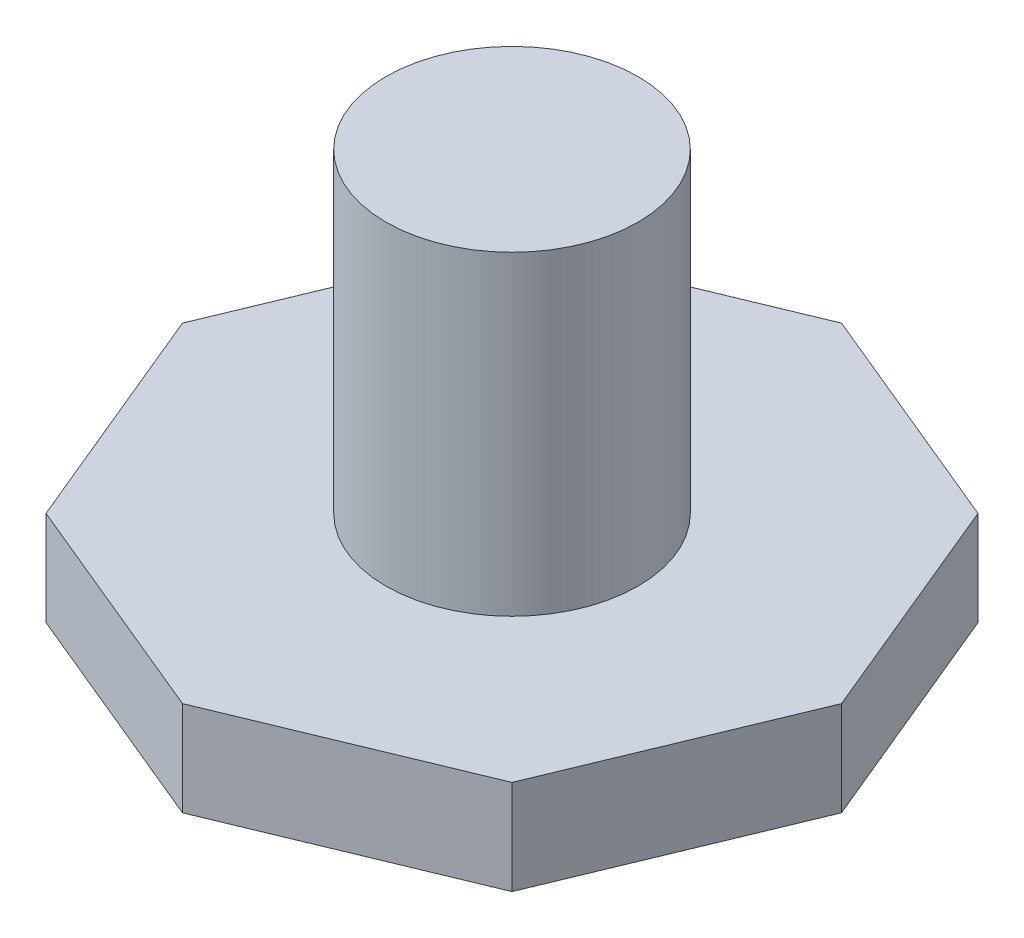
ISO-10303-21;
HEADER;
FILE_DESCRIPTION(('STEP AP214'),'2;1');
FILE_NAME('part.step','',(''),(''),'','','');
FILE_SCHEMA(('AUTOMOTIVE_DESIGN { 1 0 10303 214 1 1 1 1 }'));
ENDSEC;
DATA;
#1=APPLICATION_CONTEXT('core data for automotive mechanical design processes');
#2=APPLICATION_PROTOCOL_DEFINITION('international standard','automotive_design',2000,#1);
#3=PRODUCT_CONTEXT('',#1,'mechanical');
#4=PRODUCT('Part','Part','',(#3));
#5=PRODUCT_RELATED_PRODUCT_CATEGORY('part','',(#4));
#6=PRODUCT_DEFINITION_FORMATION('','',#4);
#7=PRODUCT_DEFINITION_CONTEXT('part definition',#1,'design');
#8=PRODUCT_DEFINITION('design','',#6,#7);
#9=PRODUCT_DEFINITION_SHAPE('','',#8);
#10=(LENGTH_UNIT() NAMED_UNIT(*) SI_UNIT(.MILLI.,.METRE.));
#11=(NAMED_UNIT(*) PLANE_ANGLE_UNIT() SI_UNIT($,.RADIAN.));
#12=(NAMED_UNIT(*) SI_UNIT($,.STERADIAN.) SOLID_ANGLE_UNIT());
#13=UNCERTAINTY_MEASURE_WITH_UNIT(LENGTH_MEASURE(1.E-05),#10,'distance_accuracy_value','');
#14=(GEOMETRIC_REPRESENTATION_CONTEXT(3) GLOBAL_UNCERTAINTY_ASSIGNED_CONTEXT((#13)) GLOBAL_UNIT_ASSIGNED_CONTEXT((#10,
#11,#12)) REPRESENTATION_CONTEXT('',''));
#15=CARTESIAN_POINT('',(0.,0.,0.));
#16=DIRECTION('',(0.,0.,1.));
#17=DIRECTION('',(1.,0.,0.));
#18=AXIS2_PLACEMENT_3D('',#15,#16,#17);
#19=CARTESIAN_POINT('',(3.69551813004517,1.5,3.69551813004512));
#20=DIRECTION('',(-0.923879532511289,0.,-0.382683432365084));
#21=DIRECTION('',(-0.382683432365084,0.,0.923879532511289));
#22=AXIS2_PLACEMENT_3D('',#19,#20,#21);
#23=PLANE('',#22);
#24=DIRECTION('',(0.382683432365084,0.,-0.923879532511289));
#25=VECTOR('',#24,1.);
#26=CARTESIAN_POINT('',(3.69551813004517,0.,3.69551813004512));
#27=LINE('',#26,#25);
#28=CARTESIAN_POINT('',(3.69551813004517,0.,3.69551813004512));
#29=VERTEX_POINT('',#28);
#30=CARTESIAN_POINT('',(5.22625185950551,0.,0.));
#31=VERTEX_POINT('',#30);
#32=EDGE_CURVE('E146',#29,#31,#27,.T.);
#33=ORIENTED_EDGE('',*,*,#32,.T.);
#34=DIRECTION('',(0.,-1.,0.));
#35=VECTOR('',#34,1.);
#36=CARTESIAN_POINT('',(5.22625185950551,1.5,0.));
#37=LINE('',#36,#35);
#38=CARTESIAN_POINT('',(5.22625185950551,1.5,0.));
#39=VERTEX_POINT('',#38);
#40=EDGE_CURVE('E46',#39,#31,#37,.T.);
#41=ORIENTED_EDGE('',*,*,#40,.F.);
#42=DIRECTION('',(0.382683432365084,0.,-0.923879532511289));
#43=VECTOR('',#42,1.);
#44=CARTESIAN_POINT('',(3.69551813004517,1.5,3.69551813004512));
#45=LINE('',#44,#43);
#46=CARTESIAN_POINT('',(3.69551813004517,1.5,3.69551813004512));
#47=VERTEX_POINT('',#46);
#48=EDGE_CURVE('E169',#47,#39,#45,.T.);
#49=ORIENTED_EDGE('',*,*,#48,.F.);
#50=DIRECTION('',(0.,-1.,0.));
#51=VECTOR('',#50,1.);
#52=CARTESIAN_POINT('',(3.69551813004517,1.5,3.69551813004512));
#53=LINE('',#52,#51);
#54=EDGE_CURVE('E142',#47,#29,#53,.T.);
#55=ORIENTED_EDGE('',*,*,#54,.T.);
#56=EDGE_LOOP('',(#33,#41,#49,#55));
#57=FACE_BOUND('',#56,.T.);
#58=ADVANCED_FACE('F43',(#57),#23,.F.);
#59=CARTESIAN_POINT('',(5.22625185950551,1.5,0.));
#60=DIRECTION('',(-0.923879532511284,0.,0.382683432365095));
#61=DIRECTION('',(0.382683432365096,0.,0.923879532511285));
#62=AXIS2_PLACEMENT_3D('',#59,#60,#61);
#63=PLANE('',#62);
#64=DIRECTION('',(-0.382683432365096,0.,-0.923879532511285));
#65=VECTOR('',#64,1.);
#66=CARTESIAN_POINT('',(5.22625185950551,0.,0.));
#67=LINE('',#66,#65);
#68=CARTESIAN_POINT('',(3.69551813004512,0.,-3.69551813004517));
#69=VERTEX_POINT('',#68);
#70=EDGE_CURVE('E150',#31,#69,#67,.T.);
#71=ORIENTED_EDGE('',*,*,#70,.T.);
#72=DIRECTION('',(0.,-1.,0.));
#73=VECTOR('',#72,1.);
#74=CARTESIAN_POINT('',(3.69551813004512,1.5,-3.69551813004517));
#75=LINE('',#74,#73);
#76=CARTESIAN_POINT('',(3.69551813004512,1.5,-3.69551813004517));
#77=VERTEX_POINT('',#76);
#78=EDGE_CURVE('E183',#77,#69,#75,.T.);
#79=ORIENTED_EDGE('',*,*,#78,.F.);
#80=DIRECTION('',(-0.382683432365096,0.,-0.923879532511285));
#81=VECTOR('',#80,1.);
#82=CARTESIAN_POINT('',(5.22625185950551,1.5,0.));
#83=LINE('',#82,#81);
#84=EDGE_CURVE('E105',#39,#77,#83,.T.);
#85=ORIENTED_EDGE('',*,*,#84,.F.);
#86=ORIENTED_EDGE('',*,*,#40,.T.);
#87=EDGE_LOOP('',(#71,#79,#85,#86));
#88=FACE_BOUND('',#87,.T.);
#89=ADVANCED_FACE('F191',(#88),#63,.F.);
#90=CARTESIAN_POINT('',(3.69551813004512,1.5,-3.69551813004517));
#91=DIRECTION('',(-0.382683432365084,0.,0.923879532511289));
#92=DIRECTION('',(0.923879532511289,0.,0.382683432365084));
#93=AXIS2_PLACEMENT_3D('',#90,#91,#92);
#94=PLANE('',#93);
#95=DIRECTION('',(-0.923879532511289,0.,-0.382683432365084));
#96=VECTOR('',#95,1.);
#97=CARTESIAN_POINT('',(3.69551813004512,0.,-3.69551813004517));
#98=LINE('',#97,#96);
#99=CARTESIAN_POINT('',(0.,0.,-5.22625185950551));
#100=VERTEX_POINT('',#99);
#101=EDGE_CURVE('E154',#69,#100,#98,.T.);
#102=ORIENTED_EDGE('',*,*,#101,.T.);
#103=DIRECTION('',(0.,-1.,0.));
#104=VECTOR('',#103,1.);
#105=CARTESIAN_POINT('',(0.,1.5,-5.22625185950551));
#106=LINE('',#105,#104);
#107=CARTESIAN_POINT('',(0.,1.5,-5.22625185950551));
#108=VERTEX_POINT('',#107);
#109=EDGE_CURVE('E180',#108,#100,#106,.T.);
#110=ORIENTED_EDGE('',*,*,#109,.F.);
#111=DIRECTION('',(-0.923879532511289,0.,-0.382683432365084));
#112=VECTOR('',#111,1.);
#113=CARTESIAN_POINT('',(3.69551813004512,1.5,-3.69551813004517));
#114=LINE('',#113,#112);
#115=EDGE_CURVE('E207',#77,#108,#114,.T.);
#116=ORIENTED_EDGE('',*,*,#115,.F.);
#117=ORIENTED_EDGE('',*,*,#78,.T.);
#118=EDGE_LOOP('',(#102,#110,#116,#117));
#119=FACE_BOUND('',#118,.T.);
#120=ADVANCED_FACE('F200',(#119),#94,.F.);
#121=CARTESIAN_POINT('',(0.,1.5,-5.22625185950551));
#122=DIRECTION('',(0.382683432365095,0.,0.923879532511285));
#123=DIRECTION('',(0.923879532511285,0.,-0.382683432365095));
#124=AXIS2_PLACEMENT_3D('',#121,#122,#123);
#125=PLANE('',#124);
#126=DIRECTION('',(-0.923879532511285,0.,0.382683432365095));
#127=VECTOR('',#126,1.);
#128=CARTESIAN_POINT('',(0.,0.,-5.22625185950551));
#129=LINE('',#128,#127);
#130=CARTESIAN_POINT('',(-3.69551813004517,0.,-3.69551813004513));
#131=VERTEX_POINT('',#130);
#132=EDGE_CURVE('E157',#100,#131,#129,.T.);
#133=ORIENTED_EDGE('',*,*,#132,.T.);
#134=DIRECTION('',(0.,-1.,0.));
#135=VECTOR('',#134,1.);
#136=CARTESIAN_POINT('',(-3.69551813004517,1.5,-3.69551813004513));
#137=LINE('',#136,#135);
#138=CARTESIAN_POINT('',(-3.69551813004517,1.5,-3.69551813004513));
#139=VERTEX_POINT('',#138);
#140=EDGE_CURVE('E176',#139,#131,#137,.T.);
#141=ORIENTED_EDGE('',*,*,#140,.F.);
#142=DIRECTION('',(-0.923879532511285,0.,0.382683432365095));
#143=VECTOR('',#142,1.);
#144=CARTESIAN_POINT('',(0.,1.5,-5.22625185950551));
#145=LINE('',#144,#143);
#146=EDGE_CURVE('E205',#108,#139,#145,.T.);
#147=ORIENTED_EDGE('',*,*,#146,.F.);
#148=ORIENTED_EDGE('',*,*,#109,.T.);
#149=EDGE_LOOP('',(#133,#141,#147,#148));
#150=FACE_BOUND('',#149,.T.);
#151=ADVANCED_FACE('F203',(#150),#125,.F.);
#152=CARTESIAN_POINT('',(-3.69551813004517,1.5,-3.69551813004513));
#153=DIRECTION('',(0.923879532511289,0.,0.382683432365084));
#154=DIRECTION('',(0.382683432365084,0.,-0.923879532511289));
#155=AXIS2_PLACEMENT_3D('',#152,#153,#154);
#156=PLANE('',#155);
#157=DIRECTION('',(-0.382683432365084,0.,0.923879532511289));
#158=VECTOR('',#157,1.);
#159=CARTESIAN_POINT('',(-3.69551813004517,0.,-3.69551813004513));
#160=LINE('',#159,#158);
#161=CARTESIAN_POINT('',(-5.22625185950551,0.,0.));
#162=VERTEX_POINT('',#161);
#163=EDGE_CURVE('E160',#131,#162,#160,.T.);
#164=ORIENTED_EDGE('',*,*,#163,.T.);
#165=DIRECTION('',(0.,-1.,0.));
#166=VECTOR('',#165,1.);
#167=CARTESIAN_POINT('',(-5.22625185950551,1.5,0.));
#168=LINE('',#167,#166);
#169=CARTESIAN_POINT('',(-5.22625185950551,1.5,0.));
#170=VERTEX_POINT('',#169);
#171=EDGE_CURVE('E135',#170,#162,#168,.T.);
#172=ORIENTED_EDGE('',*,*,#171,.F.);
#173=DIRECTION('',(-0.382683432365084,0.,0.923879532511289));
#174=VECTOR('',#173,1.);
#175=CARTESIAN_POINT('',(-3.69551813004517,1.5,-3.69551813004513));
#176=LINE('',#175,#174);
#177=EDGE_CURVE('E124',#139,#170,#176,.T.);
#178=ORIENTED_EDGE('',*,*,#177,.F.);
#179=ORIENTED_EDGE('',*,*,#140,.T.);
#180=EDGE_LOOP('',(#164,#172,#178,#179));
#181=FACE_BOUND('',#180,.T.);
#182=ADVANCED_FACE('F249',(#181),#156,.F.);
#183=CARTESIAN_POINT('',(-5.22625185950551,1.5,0.));
#184=DIRECTION('',(0.923879532511284,0.,-0.382683432365097));
#185=DIRECTION('',(-0.382683432365097,0.,-0.923879532511284));
#186=AXIS2_PLACEMENT_3D('',#183,#184,#185);
#187=PLANE('',#186);
#188=DIRECTION('',(0.382683432365097,0.,0.923879532511284));
#189=VECTOR('',#188,1.);
#190=CARTESIAN_POINT('',(-5.22625185950551,0.,0.));
#191=LINE('',#190,#189);
#192=CARTESIAN_POINT('',(-3.69551813004512,0.,3.69551813004517));
#193=VERTEX_POINT('',#192);
#194=EDGE_CURVE('E133',#162,#193,#191,.T.);
#195=ORIENTED_EDGE('',*,*,#194,.T.);
#196=DIRECTION('',(0.,-1.,0.));
#197=VECTOR('',#196,1.);
#198=CARTESIAN_POINT('',(-3.69551813004512,1.5,3.69551813004517));
#199=LINE('',#198,#197);
#200=CARTESIAN_POINT('',(-3.69551813004512,1.5,3.69551813004517));
#201=VERTEX_POINT('',#200);
#202=EDGE_CURVE('E130',#201,#193,#199,.T.);
#203=ORIENTED_EDGE('',*,*,#202,.F.);
#204=DIRECTION('',(0.382683432365097,0.,0.923879532511284));
#205=VECTOR('',#204,1.);
#206=CARTESIAN_POINT('',(-5.22625185950551,1.5,0.));
#207=LINE('',#206,#205);
#208=EDGE_CURVE('E118',#170,#201,#207,.T.);
#209=ORIENTED_EDGE('',*,*,#208,.F.);
#210=ORIENTED_EDGE('',*,*,#171,.T.);
#211=EDGE_LOOP('',(#195,#203,#209,#210));
#212=FACE_BOUND('',#211,.T.);
#213=ADVANCED_FACE('F131',(#212),#187,.F.);
#214=CARTESIAN_POINT('',(-3.69551813004512,1.5,3.69551813004517));
#215=DIRECTION('',(0.382683432365084,0.,-0.923879532511289));
#216=DIRECTION('',(-0.923879532511289,0.,-0.382683432365084));
#217=AXIS2_PLACEMENT_3D('',#214,#215,#216);
#218=PLANE('',#217);
#219=DIRECTION('',(0.923879532511289,0.,0.382683432365084));
#220=VECTOR('',#219,1.);
#221=CARTESIAN_POINT('',(-3.69551813004512,0.,3.69551813004517));
#222=LINE('',#221,#220);
#223=CARTESIAN_POINT('',(0.,0.,5.2262518595055));
#224=VERTEX_POINT('',#223);
#225=EDGE_CURVE('E90',#193,#224,#222,.T.);
#226=ORIENTED_EDGE('',*,*,#225,.T.);
#227=DIRECTION('',(0.,-1.,0.));
#228=VECTOR('',#227,1.);
#229=CARTESIAN_POINT('',(0.,1.5,5.2262518595055));
#230=LINE('',#229,#228);
#231=CARTESIAN_POINT('',(0.,1.5,5.2262518595055));
#232=VERTEX_POINT('',#231);
#233=EDGE_CURVE('E136',#232,#224,#230,.T.);
#234=ORIENTED_EDGE('',*,*,#233,.F.);
#235=DIRECTION('',(0.923879532511289,0.,0.382683432365084));
#236=VECTOR('',#235,1.);
#237=CARTESIAN_POINT('',(-3.69551813004512,1.5,3.69551813004517));
#238=LINE('',#237,#236);
#239=EDGE_CURVE('E122',#201,#232,#238,.T.);
#240=ORIENTED_EDGE('',*,*,#239,.F.);
#241=ORIENTED_EDGE('',*,*,#202,.T.);
#242=EDGE_LOOP('',(#226,#234,#240,#241));
#243=FACE_BOUND('',#242,.T.);
#244=ADVANCED_FACE('F138',(#243),#218,.F.);
#245=CARTESIAN_POINT('',(0.,1.5,5.2262518595055));
#246=DIRECTION('',(-0.382683432365095,0.,-0.923879532511284));
#247=DIRECTION('',(-0.923879532511284,0.,0.382683432365095));
#248=AXIS2_PLACEMENT_3D('',#245,#246,#247);
#249=PLANE('',#248);
#250=DIRECTION('',(0.923879532511285,0.,-0.382683432365095));
#251=VECTOR('',#250,1.);
#252=CARTESIAN_POINT('',(0.,0.,5.2262518595055));
#253=LINE('',#252,#251);
#254=EDGE_CURVE('E96',#224,#29,#253,.T.);
#255=ORIENTED_EDGE('',*,*,#254,.T.);
#256=ORIENTED_EDGE('',*,*,#54,.F.);
#257=DIRECTION('',(0.923879532511285,0.,-0.382683432365095));
#258=VECTOR('',#257,1.);
#259=CARTESIAN_POINT('',(0.,1.5,5.2262518595055));
#260=LINE('',#259,#258);
#261=EDGE_CURVE('E61',#232,#47,#260,.T.);
#262=ORIENTED_EDGE('',*,*,#261,.F.);
#263=ORIENTED_EDGE('',*,*,#233,.T.);
#264=EDGE_LOOP('',(#255,#256,#262,#263));
#265=FACE_BOUND('',#264,.T.);
#266=ADVANCED_FACE('F230',(#265),#249,.F.);
#267=CARTESIAN_POINT('',(0.,1.5,0.));
#268=DIRECTION('',(0.,1.,0.));
#269=DIRECTION('',(0.,0.,1.));
#270=AXIS2_PLACEMENT_3D('',#267,#268,#269);
#271=PLANE('',#270);
#272=CARTESIAN_POINT('',(0.,1.5,0.));
#273=DIRECTION('',(0.,1.,0.));
#274=DIRECTION('',(0.,0.,1.));
#275=AXIS2_PLACEMENT_3D('',#272,#273,#274);
#276=CIRCLE('',#275,2.);
#277=CARTESIAN_POINT('',(0.,1.5,2.));
#278=VERTEX_POINT('',#277);
#279=EDGE_CURVE('E11',#278,#278,#276,.T.);
#280=ORIENTED_EDGE('',*,*,#279,.F.);
#281=EDGE_LOOP('',(#280));
#282=FACE_BOUND('',#281,.T.);
#283=ORIENTED_EDGE('',*,*,#48,.T.);
#284=ORIENTED_EDGE('',*,*,#84,.T.);
#285=ORIENTED_EDGE('',*,*,#115,.T.);
#286=ORIENTED_EDGE('',*,*,#146,.T.);
#287=ORIENTED_EDGE('',*,*,#177,.T.);
#288=ORIENTED_EDGE('',*,*,#208,.T.);
#289=ORIENTED_EDGE('',*,*,#239,.T.);
#290=ORIENTED_EDGE('',*,*,#261,.T.);
#291=EDGE_LOOP('',(#283,#284,#285,#286,#287,#288,#289,#290));
#292=FACE_BOUND('',#291,.T.);
#293=ADVANCED_FACE('F120',(#282,#292),#271,.T.);
#294=CARTESIAN_POINT('',(0.,0.,0.));
#295=DIRECTION('',(0.,1.,0.));
#296=DIRECTION('',(0.,0.,1.));
#297=AXIS2_PLACEMENT_3D('',#294,#295,#296);
#298=PLANE('',#297);
#299=ORIENTED_EDGE('',*,*,#32,.F.);
#300=ORIENTED_EDGE('',*,*,#254,.F.);
#301=ORIENTED_EDGE('',*,*,#225,.F.);
#302=ORIENTED_EDGE('',*,*,#194,.F.);
#303=ORIENTED_EDGE('',*,*,#163,.F.);
#304=ORIENTED_EDGE('',*,*,#132,.F.);
#305=ORIENTED_EDGE('',*,*,#101,.F.);
#306=ORIENTED_EDGE('',*,*,#70,.F.);
#307=EDGE_LOOP('',(#299,#300,#301,#302,#303,#304,#305,#306));
#308=FACE_BOUND('',#307,.T.);
#309=ADVANCED_FACE('F196',(#308),#298,.F.);
#310=CARTESIAN_POINT('',(0.,6.5,0.));
#311=DIRECTION('',(0.,-1.,0.));
#312=DIRECTION('',(0.,0.,-1.));
#313=AXIS2_PLACEMENT_3D('',#310,#311,#312);
#314=CYLINDRICAL_SURFACE('',#313,2.);
#315=CARTESIAN_POINT('',(0.,6.5,0.));
#316=DIRECTION('',(0.,1.,0.));
#317=DIRECTION('',(0.,0.,1.));
#318=AXIS2_PLACEMENT_3D('',#315,#316,#317);
#319=CIRCLE('',#318,2.);
#320=CARTESIAN_POINT('',(0.,6.5,2.));
#321=VERTEX_POINT('',#320);
#322=EDGE_CURVE('E151',#321,#321,#319,.T.);
#323=ORIENTED_EDGE('',*,*,#322,.F.);
#324=EDGE_LOOP('',(#323));
#325=FACE_BOUND('',#324,.T.);
#326=ORIENTED_EDGE('',*,*,#279,.T.);
#327=EDGE_LOOP('',(#326));
#328=FACE_BOUND('',#327,.T.);
#329=ADVANCED_FACE('F223',(#325,#328),#314,.T.);
#330=CARTESIAN_POINT('',(0.,6.5,0.));
#331=DIRECTION('',(0.,1.,0.));
#332=DIRECTION('',(0.,0.,1.));
#333=AXIS2_PLACEMENT_3D('',#330,#331,#332);
#334=PLANE('',#333);
#335=ORIENTED_EDGE('',*,*,#322,.T.);
#336=EDGE_LOOP('',(#335));
#337=FACE_BOUND('',#336,.T.);
#338=ADVANCED_FACE('F221',(#337),#334,.T.);
#339=CLOSED_SHELL('',(#58,#89,#120,#151,#182,#213,#244,#266,#293,#309,#329,#338));
#340=MANIFOLD_SOLID_BREP('B2',#339);
#341=ADVANCED_BREP_SHAPE_REPRESENTATION('',(#18,#340),#14);
#342=SHAPE_DEFINITION_REPRESENTATION(#9,#341);
ENDSEC;
END-ISO-10303-21;
